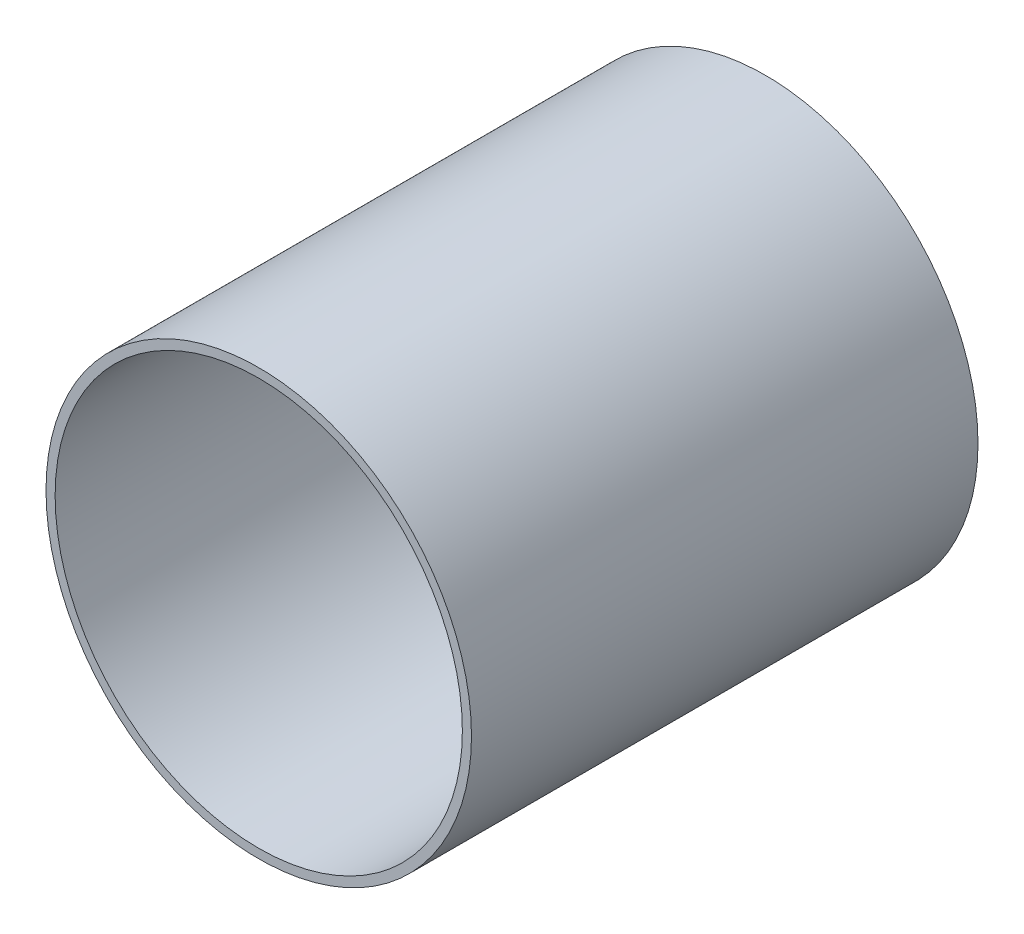
ISO-10303-21;
HEADER;
FILE_DESCRIPTION(('STEP AP214'),'2;1');
FILE_NAME('part.step','',(''),(''),'','','');
FILE_SCHEMA(('AUTOMOTIVE_DESIGN { 1 0 10303 214 1 1 1 1 }'));
ENDSEC;
DATA;
#1=APPLICATION_CONTEXT('core data for automotive mechanical design processes');
#2=APPLICATION_PROTOCOL_DEFINITION('international standard','automotive_design',2000,#1);
#3=PRODUCT_CONTEXT('',#1,'mechanical');
#4=PRODUCT('Part','Part','',(#3));
#5=PRODUCT_RELATED_PRODUCT_CATEGORY('part','',(#4));
#6=PRODUCT_DEFINITION_FORMATION('','',#4);
#7=PRODUCT_DEFINITION_CONTEXT('part definition',#1,'design');
#8=PRODUCT_DEFINITION('design','',#6,#7);
#9=PRODUCT_DEFINITION_SHAPE('','',#8);
#10=(LENGTH_UNIT() NAMED_UNIT(*) SI_UNIT(.MILLI.,.METRE.));
#11=(NAMED_UNIT(*) PLANE_ANGLE_UNIT() SI_UNIT($,.RADIAN.));
#12=(NAMED_UNIT(*) SI_UNIT($,.STERADIAN.) SOLID_ANGLE_UNIT());
#13=UNCERTAINTY_MEASURE_WITH_UNIT(LENGTH_MEASURE(1.E-05),#10,'distance_accuracy_value','');
#14=(GEOMETRIC_REPRESENTATION_CONTEXT(3) GLOBAL_UNCERTAINTY_ASSIGNED_CONTEXT((#13)) GLOBAL_UNIT_ASSIGNED_CONTEXT((#10,
#11,#12)) REPRESENTATION_CONTEXT('',''));
#15=CARTESIAN_POINT('',(0.,0.,0.));
#16=DIRECTION('',(0.,0.,1.));
#17=DIRECTION('',(1.,0.,0.));
#18=AXIS2_PLACEMENT_3D('',#15,#16,#17);
#19=CARTESIAN_POINT('',(0.,0.,25.));
#20=DIRECTION('',(0.,0.,1.));
#21=DIRECTION('',(1.,0.,0.));
#22=AXIS2_PLACEMENT_3D('',#19,#20,#21);
#23=PLANE('',#22);
#24=CARTESIAN_POINT('',(0.,0.,25.));
#25=DIRECTION('',(0.,0.,1.));
#26=DIRECTION('',(1.,0.,0.));
#27=AXIS2_PLACEMENT_3D('',#24,#25,#26);
#28=CIRCLE('',#27,10.5);
#29=CARTESIAN_POINT('',(10.5,0.,25.));
#30=VERTEX_POINT('',#29);
#31=EDGE_CURVE('E10',#30,#30,#28,.T.);
#32=ORIENTED_EDGE('',*,*,#31,.T.);
#33=EDGE_LOOP('',(#32));
#34=FACE_BOUND('',#33,.T.);
#35=CARTESIAN_POINT('',(0.,0.,25.));
#36=DIRECTION('',(0.,0.,1.));
#37=DIRECTION('',(1.,0.,0.));
#38=AXIS2_PLACEMENT_3D('',#35,#36,#37);
#39=CIRCLE('',#38,10.05);
#40=CARTESIAN_POINT('',(10.05,0.,25.));
#41=VERTEX_POINT('',#40);
#42=EDGE_CURVE('E42',#41,#41,#39,.T.);
#43=ORIENTED_EDGE('',*,*,#42,.F.);
#44=EDGE_LOOP('',(#43));
#45=FACE_BOUND('',#44,.T.);
#46=ADVANCED_FACE('F31',(#34,#45),#23,.T.);
#47=CARTESIAN_POINT('',(0.,0.,0.));
#48=DIRECTION('',(0.,0.,1.));
#49=DIRECTION('',(1.,0.,0.));
#50=AXIS2_PLACEMENT_3D('',#47,#48,#49);
#51=PLANE('',#50);
#52=CARTESIAN_POINT('',(0.,0.,0.));
#53=DIRECTION('',(0.,0.,1.));
#54=DIRECTION('',(1.,0.,0.));
#55=AXIS2_PLACEMENT_3D('',#52,#53,#54);
#56=CIRCLE('',#55,10.5);
#57=CARTESIAN_POINT('',(10.5,0.,0.));
#58=VERTEX_POINT('',#57);
#59=EDGE_CURVE('E35',#58,#58,#56,.T.);
#60=ORIENTED_EDGE('',*,*,#59,.F.);
#61=EDGE_LOOP('',(#60));
#62=FACE_BOUND('',#61,.T.);
#63=CARTESIAN_POINT('',(0.,0.,0.));
#64=DIRECTION('',(0.,0.,1.));
#65=DIRECTION('',(1.,0.,0.));
#66=AXIS2_PLACEMENT_3D('',#63,#64,#65);
#67=CIRCLE('',#66,10.05);
#68=CARTESIAN_POINT('',(10.05,0.,0.));
#69=VERTEX_POINT('',#68);
#70=EDGE_CURVE('E44',#69,#69,#67,.T.);
#71=ORIENTED_EDGE('',*,*,#70,.T.);
#72=EDGE_LOOP('',(#71));
#73=FACE_BOUND('',#72,.T.);
#74=ADVANCED_FACE('F54',(#62,#73),#51,.F.);
#75=CARTESIAN_POINT('',(0.,0.,25.));
#76=DIRECTION('',(0.,0.,-1.));
#77=DIRECTION('',(-1.,0.,0.));
#78=AXIS2_PLACEMENT_3D('',#75,#76,#77);
#79=CYLINDRICAL_SURFACE('',#78,10.5);
#80=ORIENTED_EDGE('',*,*,#31,.F.);
#81=EDGE_LOOP('',(#80));
#82=FACE_BOUND('',#81,.T.);
#83=ORIENTED_EDGE('',*,*,#59,.T.);
#84=EDGE_LOOP('',(#83));
#85=FACE_BOUND('',#84,.T.);
#86=ADVANCED_FACE('F33',(#82,#85),#79,.T.);
#87=CARTESIAN_POINT('',(0.,0.,25.));
#88=DIRECTION('',(0.,0.,-1.));
#89=DIRECTION('',(-1.,0.,0.));
#90=AXIS2_PLACEMENT_3D('',#87,#88,#89);
#91=CYLINDRICAL_SURFACE('',#90,10.05);
#92=ORIENTED_EDGE('',*,*,#42,.T.);
#93=EDGE_LOOP('',(#92));
#94=FACE_BOUND('',#93,.T.);
#95=ORIENTED_EDGE('',*,*,#70,.F.);
#96=EDGE_LOOP('',(#95));
#97=FACE_BOUND('',#96,.T.);
#98=ADVANCED_FACE('F50',(#94,#97),#91,.F.);
#99=CLOSED_SHELL('',(#46,#74,#86,#98));
#100=MANIFOLD_SOLID_BREP('B2',#99);
#101=ADVANCED_BREP_SHAPE_REPRESENTATION('',(#18,#100),#14);
#102=SHAPE_DEFINITION_REPRESENTATION(#9,#101);
ENDSEC;
END-ISO-10303-21;
